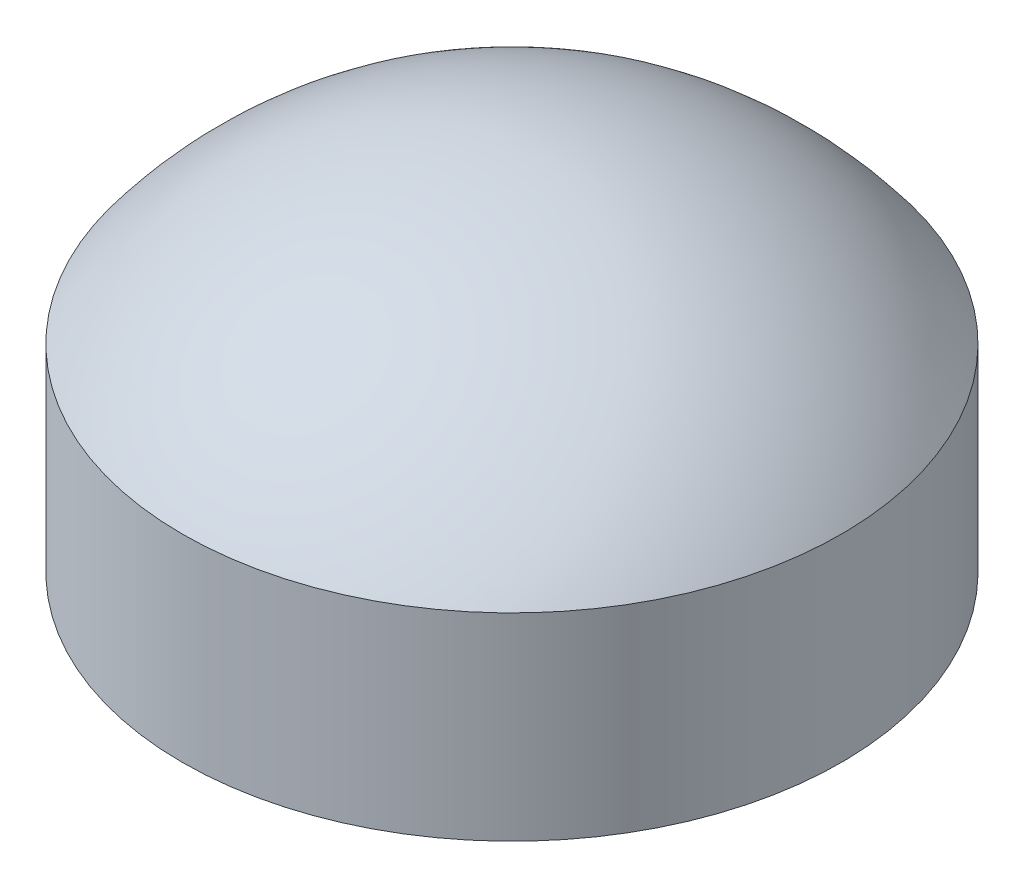
ISO-10303-21;
HEADER;
FILE_DESCRIPTION(('STEP AP214'),'2;1');
FILE_NAME('part.step','',(''),(''),'','','');
FILE_SCHEMA(('AUTOMOTIVE_DESIGN { 1 0 10303 214 1 1 1 1 }'));
ENDSEC;
DATA;
#1=APPLICATION_CONTEXT('core data for automotive mechanical design processes');
#2=APPLICATION_PROTOCOL_DEFINITION('international standard','automotive_design',2000,#1);
#3=PRODUCT_CONTEXT('',#1,'mechanical');
#4=PRODUCT('Part','Part','',(#3));
#5=PRODUCT_RELATED_PRODUCT_CATEGORY('part','',(#4));
#6=PRODUCT_DEFINITION_FORMATION('','',#4);
#7=PRODUCT_DEFINITION_CONTEXT('part definition',#1,'design');
#8=PRODUCT_DEFINITION('design','',#6,#7);
#9=PRODUCT_DEFINITION_SHAPE('','',#8);
#10=(LENGTH_UNIT() NAMED_UNIT(*) SI_UNIT(.MILLI.,.METRE.));
#11=(NAMED_UNIT(*) PLANE_ANGLE_UNIT() SI_UNIT($,.RADIAN.));
#12=(NAMED_UNIT(*) SI_UNIT($,.STERADIAN.) SOLID_ANGLE_UNIT());
#13=UNCERTAINTY_MEASURE_WITH_UNIT(LENGTH_MEASURE(1.E-05),#10,'distance_accuracy_value','');
#14=(GEOMETRIC_REPRESENTATION_CONTEXT(3) GLOBAL_UNCERTAINTY_ASSIGNED_CONTEXT((#13)) GLOBAL_UNIT_ASSIGNED_CONTEXT((#10,
#11,#12)) REPRESENTATION_CONTEXT('',''));
#15=CARTESIAN_POINT('',(0.,0.,0.));
#16=DIRECTION('',(0.,0.,1.));
#17=DIRECTION('',(1.,0.,0.));
#18=AXIS2_PLACEMENT_3D('',#15,#16,#17);
#19=CARTESIAN_POINT('',(0.,12.,0.));
#20=DIRECTION('',(0.,-1.,0.));
#21=DIRECTION('',(0.,0.,-1.));
#22=AXIS2_PLACEMENT_3D('',#19,#20,#21);
#23=CYLINDRICAL_SURFACE('',#22,20.);
#24=CARTESIAN_POINT('',(0.,12.,0.));
#25=DIRECTION('',(0.,1.,0.));
#26=DIRECTION('',(0.,0.,1.));
#27=AXIS2_PLACEMENT_3D('',#24,#25,#26);
#28=CIRCLE('',#27,20.);
#29=CARTESIAN_POINT('',(0.,12.,20.));
#30=VERTEX_POINT('',#29);
#31=EDGE_CURVE('E10',#30,#30,#28,.T.);
#32=ORIENTED_EDGE('',*,*,#31,.F.);
#33=EDGE_LOOP('',(#32));
#34=FACE_BOUND('',#33,.T.);
#35=CARTESIAN_POINT('',(0.,0.,0.));
#36=DIRECTION('',(0.,1.,0.));
#37=DIRECTION('',(0.,0.,1.));
#38=AXIS2_PLACEMENT_3D('',#35,#36,#37);
#39=CIRCLE('',#38,20.);
#40=CARTESIAN_POINT('',(0.,0.,20.));
#41=VERTEX_POINT('',#40);
#42=EDGE_CURVE('E44',#41,#41,#39,.T.);
#43=ORIENTED_EDGE('',*,*,#42,.T.);
#44=EDGE_LOOP('',(#43));
#45=FACE_BOUND('',#44,.T.);
#46=ADVANCED_FACE('F37',(#34,#45),#23,.T.);
#47=CARTESIAN_POINT('',(0.,-3.00000000000001,0.));
#48=DIRECTION('',(0.,0.,1.));
#49=DIRECTION('',(1.,0.,0.));
#50=AXIS2_PLACEMENT_3D('',#47,#48,#49);
#51=SPHERICAL_SURFACE('',#50,25.);
#52=CARTESIAN_POINT('',(0.,-3.00000000000001,0.));
#53=DIRECTION('',(0.,1.,0.));
#54=DIRECTION('',(0.,0.,1.));
#55=AXIS2_PLACEMENT_3D('',#52,#53,#54);
#56=SPHERICAL_SURFACE('',#55,25.);
#57=ORIENTED_EDGE('',*,*,#31,.T.);
#58=EDGE_LOOP('',(#57));
#59=FACE_BOUND('',#58,.T.);
#60=ADVANCED_FACE('F39',(#59),#56,.T.);
#61=CARTESIAN_POINT('',(0.,0.,0.));
#62=DIRECTION('',(0.,1.,0.));
#63=DIRECTION('',(0.,0.,1.));
#64=AXIS2_PLACEMENT_3D('',#61,#62,#63);
#65=PLANE('',#64);
#66=ORIENTED_EDGE('',*,*,#42,.F.);
#67=EDGE_LOOP('',(#66));
#68=FACE_BOUND('',#67,.T.);
#69=ADVANCED_FACE('F51',(#68),#65,.F.);
#70=CLOSED_SHELL('',(#46,#60,#69));
#71=MANIFOLD_SOLID_BREP('B2',#70);
#72=ADVANCED_BREP_SHAPE_REPRESENTATION('',(#18,#71),#14);
#73=SHAPE_DEFINITION_REPRESENTATION(#9,#72);
ENDSEC;
END-ISO-10303-21;
